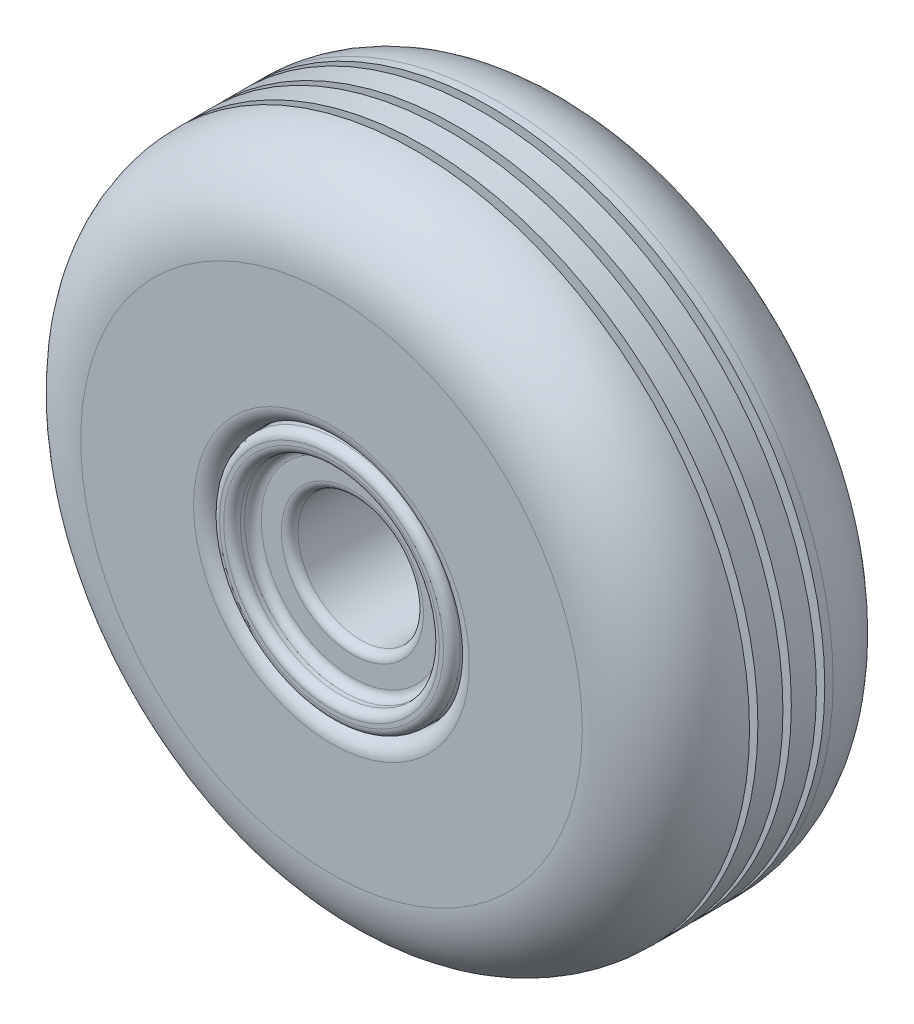
ISO-10303-21;
HEADER;
FILE_DESCRIPTION(('STEP AP214'),'2;1');
FILE_NAME('part.step','',(''),(''),'','','');
FILE_SCHEMA(('AUTOMOTIVE_DESIGN { 1 0 10303 214 1 1 1 1 }'));
ENDSEC;
DATA;
#1=APPLICATION_CONTEXT('core data for automotive mechanical design processes');
#2=APPLICATION_PROTOCOL_DEFINITION('international standard','automotive_design',2000,#1);
#3=PRODUCT_CONTEXT('',#1,'mechanical');
#4=PRODUCT('Part','Part','',(#3));
#5=PRODUCT_RELATED_PRODUCT_CATEGORY('part','',(#4));
#6=PRODUCT_DEFINITION_FORMATION('','',#4);
#7=PRODUCT_DEFINITION_CONTEXT('part definition',#1,'design');
#8=PRODUCT_DEFINITION('design','',#6,#7);
#9=PRODUCT_DEFINITION_SHAPE('','',#8);
#10=(LENGTH_UNIT() NAMED_UNIT(*) SI_UNIT(.MILLI.,.METRE.));
#11=(NAMED_UNIT(*) PLANE_ANGLE_UNIT() SI_UNIT($,.RADIAN.));
#12=(NAMED_UNIT(*) SI_UNIT($,.STERADIAN.) SOLID_ANGLE_UNIT());
#13=UNCERTAINTY_MEASURE_WITH_UNIT(LENGTH_MEASURE(1.E-05),#10,'distance_accuracy_value','');
#14=(GEOMETRIC_REPRESENTATION_CONTEXT(3) GLOBAL_UNCERTAINTY_ASSIGNED_CONTEXT((#13)) GLOBAL_UNIT_ASSIGNED_CONTEXT((#10,
#11,#12)) REPRESENTATION_CONTEXT('',''));
#15=CARTESIAN_POINT('',(0.,0.,0.));
#16=DIRECTION('',(0.,0.,1.));
#17=DIRECTION('',(1.,0.,0.));
#18=AXIS2_PLACEMENT_3D('',#15,#16,#17);
#19=CARTESIAN_POINT('',(0.,36.83,-38.1));
#20=DIRECTION('',(0.,0.,1.));
#21=DIRECTION('',(1.,0.,0.));
#22=AXIS2_PLACEMENT_3D('',#19,#20,#21);
#23=PLANE('',#22);
#24=CARTESIAN_POINT('',(0.,0.,-38.1));
#25=DIRECTION('',(0.,0.,1.));
#26=DIRECTION('',(1.,0.,0.));
#27=AXIS2_PLACEMENT_3D('',#24,#25,#26);
#28=CIRCLE('',#27,41.91);
#29=CARTESIAN_POINT('',(41.91,0.,-38.1));
#30=VERTEX_POINT('',#29);
#31=EDGE_CURVE('E61',#30,#30,#28,.T.);
#32=ORIENTED_EDGE('',*,*,#31,.T.);
#33=EDGE_LOOP('',(#32));
#34=FACE_BOUND('',#33,.T.);
#35=CARTESIAN_POINT('',(0.,0.,-38.1));
#36=DIRECTION('',(0.,0.,1.));
#37=DIRECTION('',(1.,0.,0.));
#38=AXIS2_PLACEMENT_3D('',#35,#36,#37);
#39=CIRCLE('',#38,76.1999999999998);
#40=CARTESIAN_POINT('',(76.1999999999998,0.,-38.1));
#41=VERTEX_POINT('',#40);
#42=EDGE_CURVE('E66',#41,#41,#39,.T.);
#43=ORIENTED_EDGE('',*,*,#42,.F.);
#44=EDGE_LOOP('',(#43));
#45=FACE_BOUND('',#44,.T.);
#46=ADVANCED_FACE('F46',(#34,#45),#23,.F.);
#47=CARTESIAN_POINT('',(0.,0.,-12.7));
#48=DIRECTION('',(0.,0.,1.));
#49=DIRECTION('',(1.,0.,0.));
#50=AXIS2_PLACEMENT_3D('',#47,#48,#49);
#51=TOROIDAL_SURFACE('',#50,76.2,25.4);
#52=CARTESIAN_POINT('',(0.,0.,-12.6999999999998));
#53=DIRECTION('',(0.,0.,1.));
#54=DIRECTION('',(1.,0.,0.));
#55=AXIS2_PLACEMENT_3D('',#52,#53,#54);
#56=CIRCLE('',#55,101.6);
#57=CARTESIAN_POINT('',(101.6,0.,-12.6999999999998));
#58=VERTEX_POINT('',#57);
#59=EDGE_CURVE('E69',#58,#58,#56,.T.);
#60=ORIENTED_EDGE('',*,*,#59,.F.);
#61=EDGE_LOOP('',(#60));
#62=FACE_BOUND('',#61,.T.);
#63=ORIENTED_EDGE('',*,*,#42,.T.);
#64=EDGE_LOOP('',(#63));
#65=FACE_BOUND('',#64,.T.);
#66=ADVANCED_FACE('F132',(#62,#65),#51,.T.);
#67=CARTESIAN_POINT('',(0.,0.,0.));
#68=DIRECTION('',(0.,0.,1.));
#69=DIRECTION('',(1.,0.,0.));
#70=AXIS2_PLACEMENT_3D('',#67,#68,#69);
#71=CYLINDRICAL_SURFACE('',#70,101.6);
#72=ORIENTED_EDGE('',*,*,#59,.T.);
#73=EDGE_LOOP('',(#72));
#74=FACE_BOUND('',#73,.T.);
#75=CARTESIAN_POINT('',(0.,0.,-10.16));
#76=DIRECTION('',(0.,0.,1.));
#77=DIRECTION('',(1.,0.,0.));
#78=AXIS2_PLACEMENT_3D('',#75,#76,#77);
#79=CIRCLE('',#78,101.6);
#80=CARTESIAN_POINT('',(101.6,0.,-10.16));
#81=VERTEX_POINT('',#80);
#82=EDGE_CURVE('E72',#81,#81,#79,.T.);
#83=ORIENTED_EDGE('',*,*,#82,.F.);
#84=EDGE_LOOP('',(#83));
#85=FACE_BOUND('',#84,.T.);
#86=ADVANCED_FACE('F138',(#74,#85),#71,.T.);
#87=CARTESIAN_POINT('',(0.,97.1840280376558,-10.16));
#88=DIRECTION('',(0.,0.,1.));
#89=DIRECTION('',(1.,0.,0.));
#90=AXIS2_PLACEMENT_3D('',#87,#88,#89);
#91=PLANE('',#90);
#92=ORIENTED_EDGE('',*,*,#82,.T.);
#93=EDGE_LOOP('',(#92));
#94=FACE_BOUND('',#93,.T.);
#95=CARTESIAN_POINT('',(0.,0.,-10.16));
#96=DIRECTION('',(0.,0.,1.));
#97=DIRECTION('',(1.,0.,0.));
#98=AXIS2_PLACEMENT_3D('',#95,#96,#97);
#99=CIRCLE('',#98,97.1840280376558);
#100=CARTESIAN_POINT('',(97.1840280376558,0.,-10.16));
#101=VERTEX_POINT('',#100);
#102=EDGE_CURVE('E75',#101,#101,#99,.T.);
#103=ORIENTED_EDGE('',*,*,#102,.F.);
#104=EDGE_LOOP('',(#103));
#105=FACE_BOUND('',#104,.T.);
#106=ADVANCED_FACE('F217',(#94,#105),#91,.T.);
#107=CARTESIAN_POINT('',(0.,0.,0.));
#108=DIRECTION('',(0.,0.,1.));
#109=DIRECTION('',(1.,0.,0.));
#110=AXIS2_PLACEMENT_3D('',#107,#108,#109);
#111=CYLINDRICAL_SURFACE('',#110,97.1840280376558);
#112=ORIENTED_EDGE('',*,*,#102,.T.);
#113=EDGE_LOOP('',(#112));
#114=FACE_BOUND('',#113,.T.);
#115=CARTESIAN_POINT('',(0.,0.,-7.62));
#116=DIRECTION('',(0.,0.,1.));
#117=DIRECTION('',(1.,0.,0.));
#118=AXIS2_PLACEMENT_3D('',#115,#116,#117);
#119=CIRCLE('',#118,97.1840280376558);
#120=CARTESIAN_POINT('',(97.1840280376558,0.,-7.62));
#121=VERTEX_POINT('',#120);
#122=EDGE_CURVE('E78',#121,#121,#119,.T.);
#123=ORIENTED_EDGE('',*,*,#122,.F.);
#124=EDGE_LOOP('',(#123));
#125=FACE_BOUND('',#124,.T.);
#126=ADVANCED_FACE('F222',(#114,#125),#111,.T.);
#127=CARTESIAN_POINT('',(0.,101.6,-7.62));
#128=DIRECTION('',(0.,0.,-1.));
#129=DIRECTION('',(-1.,0.,0.));
#130=AXIS2_PLACEMENT_3D('',#127,#128,#129);
#131=PLANE('',#130);
#132=ORIENTED_EDGE('',*,*,#122,.T.);
#133=EDGE_LOOP('',(#132));
#134=FACE_BOUND('',#133,.T.);
#135=CARTESIAN_POINT('',(0.,0.,-7.62));
#136=DIRECTION('',(0.,0.,1.));
#137=DIRECTION('',(1.,0.,0.));
#138=AXIS2_PLACEMENT_3D('',#135,#136,#137);
#139=CIRCLE('',#138,101.6);
#140=CARTESIAN_POINT('',(101.6,0.,-7.62));
#141=VERTEX_POINT('',#140);
#142=EDGE_CURVE('E81',#141,#141,#139,.T.);
#143=ORIENTED_EDGE('',*,*,#142,.F.);
#144=EDGE_LOOP('',(#143));
#145=FACE_BOUND('',#144,.T.);
#146=ADVANCED_FACE('F231',(#134,#145),#131,.T.);
#147=CARTESIAN_POINT('',(0.,0.,0.));
#148=DIRECTION('',(0.,0.,1.));
#149=DIRECTION('',(1.,0.,0.));
#150=AXIS2_PLACEMENT_3D('',#147,#148,#149);
#151=CYLINDRICAL_SURFACE('',#150,101.6);
#152=ORIENTED_EDGE('',*,*,#142,.T.);
#153=EDGE_LOOP('',(#152));
#154=FACE_BOUND('',#153,.T.);
#155=CARTESIAN_POINT('',(0.,0.,0.));
#156=DIRECTION('',(0.,0.,1.));
#157=DIRECTION('',(1.,0.,0.));
#158=AXIS2_PLACEMENT_3D('',#155,#156,#157);
#159=CIRCLE('',#158,101.6);
#160=CARTESIAN_POINT('',(101.6,0.,0.));
#161=VERTEX_POINT('',#160);
#162=EDGE_CURVE('E84',#161,#161,#159,.T.);
#163=ORIENTED_EDGE('',*,*,#162,.F.);
#164=EDGE_LOOP('',(#163));
#165=FACE_BOUND('',#164,.T.);
#166=ADVANCED_FACE('F207',(#154,#165),#151,.T.);
#167=CARTESIAN_POINT('',(0.,97.1840280376558,0.));
#168=DIRECTION('',(0.,0.,1.));
#169=DIRECTION('',(1.,0.,0.));
#170=AXIS2_PLACEMENT_3D('',#167,#168,#169);
#171=PLANE('',#170);
#172=ORIENTED_EDGE('',*,*,#162,.T.);
#173=EDGE_LOOP('',(#172));
#174=FACE_BOUND('',#173,.T.);
#175=CARTESIAN_POINT('',(0.,0.,0.));
#176=DIRECTION('',(0.,0.,1.));
#177=DIRECTION('',(1.,0.,0.));
#178=AXIS2_PLACEMENT_3D('',#175,#176,#177);
#179=CIRCLE('',#178,97.1840280376558);
#180=CARTESIAN_POINT('',(97.1840280376558,0.,0.));
#181=VERTEX_POINT('',#180);
#182=EDGE_CURVE('E87',#181,#181,#179,.T.);
#183=ORIENTED_EDGE('',*,*,#182,.F.);
#184=EDGE_LOOP('',(#183));
#185=FACE_BOUND('',#184,.T.);
#186=ADVANCED_FACE('F201',(#174,#185),#171,.T.);
#187=CARTESIAN_POINT('',(0.,0.,0.));
#188=DIRECTION('',(0.,0.,1.));
#189=DIRECTION('',(1.,0.,0.));
#190=AXIS2_PLACEMENT_3D('',#187,#188,#189);
#191=CYLINDRICAL_SURFACE('',#190,97.1840280376558);
#192=ORIENTED_EDGE('',*,*,#182,.T.);
#193=EDGE_LOOP('',(#192));
#194=FACE_BOUND('',#193,.T.);
#195=CARTESIAN_POINT('',(0.,0.,2.54));
#196=DIRECTION('',(0.,0.,1.));
#197=DIRECTION('',(1.,0.,0.));
#198=AXIS2_PLACEMENT_3D('',#195,#196,#197);
#199=CIRCLE('',#198,97.1840280376558);
#200=CARTESIAN_POINT('',(97.1840280376558,0.,2.54));
#201=VERTEX_POINT('',#200);
#202=EDGE_CURVE('E90',#201,#201,#199,.T.);
#203=ORIENTED_EDGE('',*,*,#202,.F.);
#204=EDGE_LOOP('',(#203));
#205=FACE_BOUND('',#204,.T.);
#206=ADVANCED_FACE('F206',(#194,#205),#191,.T.);
#207=CARTESIAN_POINT('',(0.,101.6,2.54));
#208=DIRECTION('',(0.,0.,-1.));
#209=DIRECTION('',(-1.,0.,0.));
#210=AXIS2_PLACEMENT_3D('',#207,#208,#209);
#211=PLANE('',#210);
#212=ORIENTED_EDGE('',*,*,#202,.T.);
#213=EDGE_LOOP('',(#212));
#214=FACE_BOUND('',#213,.T.);
#215=CARTESIAN_POINT('',(0.,0.,2.54));
#216=DIRECTION('',(0.,0.,1.));
#217=DIRECTION('',(1.,0.,0.));
#218=AXIS2_PLACEMENT_3D('',#215,#216,#217);
#219=CIRCLE('',#218,101.6);
#220=CARTESIAN_POINT('',(101.6,0.,2.54));
#221=VERTEX_POINT('',#220);
#222=EDGE_CURVE('E93',#221,#221,#219,.T.);
#223=ORIENTED_EDGE('',*,*,#222,.F.);
#224=EDGE_LOOP('',(#223));
#225=FACE_BOUND('',#224,.T.);
#226=ADVANCED_FACE('F255',(#214,#225),#211,.T.);
#227=CARTESIAN_POINT('',(0.,0.,0.));
#228=DIRECTION('',(0.,0.,1.));
#229=DIRECTION('',(1.,0.,0.));
#230=AXIS2_PLACEMENT_3D('',#227,#228,#229);
#231=CYLINDRICAL_SURFACE('',#230,101.6);
#232=ORIENTED_EDGE('',*,*,#222,.T.);
#233=EDGE_LOOP('',(#232));
#234=FACE_BOUND('',#233,.T.);
#235=CARTESIAN_POINT('',(0.,0.,10.1599999999998));
#236=DIRECTION('',(0.,0.,1.));
#237=DIRECTION('',(1.,0.,0.));
#238=AXIS2_PLACEMENT_3D('',#235,#236,#237);
#239=CIRCLE('',#238,101.6);
#240=CARTESIAN_POINT('',(101.6,0.,10.1599999999998));
#241=VERTEX_POINT('',#240);
#242=EDGE_CURVE('E96',#241,#241,#239,.T.);
#243=ORIENTED_EDGE('',*,*,#242,.F.);
#244=EDGE_LOOP('',(#243));
#245=FACE_BOUND('',#244,.T.);
#246=ADVANCED_FACE('F193',(#234,#245),#231,.T.);
#247=CARTESIAN_POINT('',(0.,97.1840280376558,10.1599999999998));
#248=DIRECTION('',(0.,0.,1.));
#249=DIRECTION('',(1.,0.,0.));
#250=AXIS2_PLACEMENT_3D('',#247,#248,#249);
#251=PLANE('',#250);
#252=ORIENTED_EDGE('',*,*,#242,.T.);
#253=EDGE_LOOP('',(#252));
#254=FACE_BOUND('',#253,.T.);
#255=CARTESIAN_POINT('',(0.,0.,10.1599999999998));
#256=DIRECTION('',(0.,0.,1.));
#257=DIRECTION('',(1.,0.,0.));
#258=AXIS2_PLACEMENT_3D('',#255,#256,#257);
#259=CIRCLE('',#258,97.1840280376558);
#260=CARTESIAN_POINT('',(97.1840280376558,0.,10.1599999999998));
#261=VERTEX_POINT('',#260);
#262=EDGE_CURVE('E99',#261,#261,#259,.T.);
#263=ORIENTED_EDGE('',*,*,#262,.F.);
#264=EDGE_LOOP('',(#263));
#265=FACE_BOUND('',#264,.T.);
#266=ADVANCED_FACE('F128',(#254,#265),#251,.T.);
#267=CARTESIAN_POINT('',(0.,0.,0.));
#268=DIRECTION('',(0.,0.,1.));
#269=DIRECTION('',(1.,0.,0.));
#270=AXIS2_PLACEMENT_3D('',#267,#268,#269);
#271=CYLINDRICAL_SURFACE('',#270,97.1840280376558);
#272=ORIENTED_EDGE('',*,*,#262,.T.);
#273=EDGE_LOOP('',(#272));
#274=FACE_BOUND('',#273,.T.);
#275=CARTESIAN_POINT('',(0.,0.,12.6999999999998));
#276=DIRECTION('',(0.,0.,1.));
#277=DIRECTION('',(1.,0.,0.));
#278=AXIS2_PLACEMENT_3D('',#275,#276,#277);
#279=CIRCLE('',#278,97.1840280376558);
#280=CARTESIAN_POINT('',(97.1840280376558,0.,12.6999999999998));
#281=VERTEX_POINT('',#280);
#282=EDGE_CURVE('E102',#281,#281,#279,.T.);
#283=ORIENTED_EDGE('',*,*,#282,.F.);
#284=EDGE_LOOP('',(#283));
#285=FACE_BOUND('',#284,.T.);
#286=ADVANCED_FACE('F122',(#274,#285),#271,.T.);
#287=CARTESIAN_POINT('',(0.,101.6,12.6999999999998));
#288=DIRECTION('',(0.,0.,-1.));
#289=DIRECTION('',(-1.,0.,0.));
#290=AXIS2_PLACEMENT_3D('',#287,#288,#289);
#291=PLANE('',#290);
#292=ORIENTED_EDGE('',*,*,#282,.T.);
#293=EDGE_LOOP('',(#292));
#294=FACE_BOUND('',#293,.T.);
#295=CARTESIAN_POINT('',(0.,0.,12.6999999999998));
#296=DIRECTION('',(0.,0.,1.));
#297=DIRECTION('',(1.,0.,0.));
#298=AXIS2_PLACEMENT_3D('',#295,#296,#297);
#299=CIRCLE('',#298,101.6);
#300=CARTESIAN_POINT('',(101.6,0.,12.6999999999998));
#301=VERTEX_POINT('',#300);
#302=EDGE_CURVE('E105',#301,#301,#299,.T.);
#303=ORIENTED_EDGE('',*,*,#302,.F.);
#304=EDGE_LOOP('',(#303));
#305=FACE_BOUND('',#304,.T.);
#306=ADVANCED_FACE('F117',(#294,#305),#291,.T.);
#307=CARTESIAN_POINT('',(0.,0.,12.7));
#308=DIRECTION('',(0.,0.,1.));
#309=DIRECTION('',(1.,0.,0.));
#310=AXIS2_PLACEMENT_3D('',#307,#308,#309);
#311=TOROIDAL_SURFACE('',#310,76.2,25.4);
#312=CARTESIAN_POINT('',(0.,0.,38.1));
#313=DIRECTION('',(0.,0.,1.));
#314=DIRECTION('',(1.,0.,0.));
#315=AXIS2_PLACEMENT_3D('',#312,#313,#314);
#316=CIRCLE('',#315,76.1999999999998);
#317=CARTESIAN_POINT('',(76.1999999999998,0.,38.1));
#318=VERTEX_POINT('',#317);
#319=EDGE_CURVE('E108',#318,#318,#316,.T.);
#320=ORIENTED_EDGE('',*,*,#319,.F.);
#321=EDGE_LOOP('',(#320));
#322=FACE_BOUND('',#321,.T.);
#323=ORIENTED_EDGE('',*,*,#302,.T.);
#324=EDGE_LOOP('',(#323));
#325=FACE_BOUND('',#324,.T.);
#326=ADVANCED_FACE('F114',(#322,#325),#311,.T.);
#327=CARTESIAN_POINT('',(0.,76.1999999999998,38.1));
#328=DIRECTION('',(0.,0.,-1.));
#329=DIRECTION('',(-1.,0.,0.));
#330=AXIS2_PLACEMENT_3D('',#327,#328,#329);
#331=PLANE('',#330);
#332=CARTESIAN_POINT('',(0.,0.,38.1));
#333=DIRECTION('',(0.,0.,-1.));
#334=DIRECTION('',(-1.,0.,0.));
#335=AXIS2_PLACEMENT_3D('',#332,#333,#334);
#336=CIRCLE('',#335,41.91);
#337=CARTESIAN_POINT('',(-41.91,0.,38.1));
#338=VERTEX_POINT('',#337);
#339=EDGE_CURVE('E11',#338,#338,#336,.T.);
#340=ORIENTED_EDGE('',*,*,#339,.T.);
#341=EDGE_LOOP('',(#340));
#342=FACE_BOUND('',#341,.T.);
#343=ORIENTED_EDGE('',*,*,#319,.T.);
#344=EDGE_LOOP('',(#343));
#345=FACE_BOUND('',#344,.T.);
#346=ADVANCED_FACE('F112',(#342,#345),#331,.F.);
#347=CARTESIAN_POINT('',(0.,0.,0.));
#348=DIRECTION('',(0.,0.,1.));
#349=DIRECTION('',(1.,0.,0.));
#350=AXIS2_PLACEMENT_3D('',#347,#348,#349);
#351=CYLINDRICAL_SURFACE('',#350,36.83);
#352=CARTESIAN_POINT('',(0.,0.,-33.02));
#353=DIRECTION('',(0.,0.,1.));
#354=DIRECTION('',(1.,0.,0.));
#355=AXIS2_PLACEMENT_3D('',#352,#353,#354);
#356=CIRCLE('',#355,36.83);
#357=CARTESIAN_POINT('',(36.83,0.,-33.02));
#358=VERTEX_POINT('',#357);
#359=EDGE_CURVE('E53',#358,#358,#356,.F.);
#360=ORIENTED_EDGE('',*,*,#359,.T.);
#361=EDGE_LOOP('',(#360));
#362=FACE_BOUND('',#361,.T.);
#363=CARTESIAN_POINT('',(0.,0.,33.02));
#364=DIRECTION('',(0.,0.,-1.));
#365=DIRECTION('',(-1.,0.,0.));
#366=AXIS2_PLACEMENT_3D('',#363,#364,#365);
#367=CIRCLE('',#366,36.83);
#368=CARTESIAN_POINT('',(-36.83,0.,33.02));
#369=VERTEX_POINT('',#368);
#370=EDGE_CURVE('E57',#369,#369,#367,.F.);
#371=ORIENTED_EDGE('',*,*,#370,.T.);
#372=EDGE_LOOP('',(#371));
#373=FACE_BOUND('',#372,.T.);
#374=ADVANCED_FACE('F145',(#362,#373),#351,.F.);
#375=CARTESIAN_POINT('',(0.,0.,-33.02));
#376=DIRECTION('',(0.,0.,1.));
#377=DIRECTION('',(1.,0.,0.));
#378=AXIS2_PLACEMENT_3D('',#375,#376,#377);
#379=TOROIDAL_SURFACE('',#378,41.91,5.08);
#380=ORIENTED_EDGE('',*,*,#359,.F.);
#381=EDGE_LOOP('',(#380));
#382=FACE_BOUND('',#381,.T.);
#383=ORIENTED_EDGE('',*,*,#31,.F.);
#384=EDGE_LOOP('',(#383));
#385=FACE_BOUND('',#384,.T.);
#386=ADVANCED_FACE('F143',(#382,#385),#379,.T.);
#387=CARTESIAN_POINT('',(0.,0.,33.02));
#388=DIRECTION('',(0.,0.,-1.));
#389=DIRECTION('',(-1.,0.,0.));
#390=AXIS2_PLACEMENT_3D('',#387,#388,#389);
#391=TOROIDAL_SURFACE('',#390,41.91,5.08);
#392=ORIENTED_EDGE('',*,*,#339,.F.);
#393=EDGE_LOOP('',(#392));
#394=FACE_BOUND('',#393,.T.);
#395=ORIENTED_EDGE('',*,*,#370,.F.);
#396=EDGE_LOOP('',(#395));
#397=FACE_BOUND('',#396,.T.);
#398=ADVANCED_FACE('F48',(#394,#397),#391,.T.);
#399=CLOSED_SHELL('',(#46,#66,#86,#106,#126,#146,#166,#186,#206,#226,#246,#266,#286,#306,#326,
#346,#374,#386,#398));
#400=MANIFOLD_SOLID_BREP('B2',#399);
#401=CARTESIAN_POINT('',(0.,0.,-31.75));
#402=DIRECTION('',(0.,0.,1.));
#403=DIRECTION('',(1.,0.,0.));
#404=AXIS2_PLACEMENT_3D('',#401,#402,#403);
#405=PLANE('',#404);
#406=CARTESIAN_POINT('',(0.,0.,-31.75));
#407=DIRECTION('',(0.,0.,1.));
#408=DIRECTION('',(1.,0.,0.));
#409=AXIS2_PLACEMENT_3D('',#406,#407,#408);
#410=CIRCLE('',#409,27.686);
#411=CARTESIAN_POINT('',(27.686,0.,-31.75));
#412=VERTEX_POINT('',#411);
#413=EDGE_CURVE('E379',#412,#412,#410,.F.);
#414=ORIENTED_EDGE('',*,*,#413,.T.);
#415=EDGE_LOOP('',(#414));
#416=FACE_BOUND('',#415,.T.);
#417=CARTESIAN_POINT('',(0.,0.,-31.75));
#418=DIRECTION('',(0.,0.,1.));
#419=DIRECTION('',(1.,0.,0.));
#420=AXIS2_PLACEMENT_3D('',#417,#418,#419);
#421=CIRCLE('',#420,21.59);
#422=CARTESIAN_POINT('',(21.59,0.,-31.75));
#423=VERTEX_POINT('',#422);
#424=EDGE_CURVE('E383',#423,#423,#421,.T.);
#425=ORIENTED_EDGE('',*,*,#424,.T.);
#426=EDGE_LOOP('',(#425));
#427=FACE_BOUND('',#426,.T.);
#428=ADVANCED_FACE('F368',(#416,#427),#405,.F.);
#429=CARTESIAN_POINT('',(0.,0.,31.75));
#430=DIRECTION('',(0.,0.,1.));
#431=DIRECTION('',(1.,0.,0.));
#432=AXIS2_PLACEMENT_3D('',#429,#430,#431);
#433=CYLINDRICAL_SURFACE('',#432,30.226);
#434=CARTESIAN_POINT('',(0.,0.,-34.29));
#435=DIRECTION('',(0.,0.,1.));
#436=DIRECTION('',(1.,0.,0.));
#437=AXIS2_PLACEMENT_3D('',#434,#435,#436);
#438=CIRCLE('',#437,30.226);
#439=CARTESIAN_POINT('',(30.226,0.,-34.29));
#440=VERTEX_POINT('',#439);
#441=EDGE_CURVE('E388',#440,#440,#438,.T.);
#442=ORIENTED_EDGE('',*,*,#441,.T.);
#443=EDGE_LOOP('',(#442));
#444=FACE_BOUND('',#443,.T.);
#445=CARTESIAN_POINT('',(0.,0.,-35.56));
#446=DIRECTION('',(0.,0.,1.));
#447=DIRECTION('',(1.,0.,0.));
#448=AXIS2_PLACEMENT_3D('',#445,#446,#447);
#449=CIRCLE('',#448,30.226);
#450=CARTESIAN_POINT('',(30.226,0.,-35.56));
#451=VERTEX_POINT('',#450);
#452=EDGE_CURVE('E391',#451,#451,#449,.F.);
#453=ORIENTED_EDGE('',*,*,#452,.T.);
#454=EDGE_LOOP('',(#453));
#455=FACE_BOUND('',#454,.T.);
#456=ADVANCED_FACE('F445',(#444,#455),#433,.F.);
#457=CARTESIAN_POINT('',(0.,30.226,-38.1));
#458=DIRECTION('',(0.,0.,1.));
#459=DIRECTION('',(1.,0.,0.));
#460=AXIS2_PLACEMENT_3D('',#457,#458,#459);
#461=PLANE('',#460);
#462=CARTESIAN_POINT('',(0.,0.,-38.1));
#463=DIRECTION('',(0.,0.,1.));
#464=DIRECTION('',(1.,0.,0.));
#465=AXIS2_PLACEMENT_3D('',#462,#463,#464);
#466=CIRCLE('',#465,34.036);
#467=CARTESIAN_POINT('',(34.036,0.,-38.1));
#468=VERTEX_POINT('',#467);
#469=EDGE_CURVE('E45',#468,#468,#466,.F.);
#470=ORIENTED_EDGE('',*,*,#469,.T.);
#471=EDGE_LOOP('',(#470));
#472=FACE_BOUND('',#471,.T.);
#473=CARTESIAN_POINT('',(0.,0.,-38.1));
#474=DIRECTION('',(0.,0.,1.));
#475=DIRECTION('',(1.,0.,0.));
#476=AXIS2_PLACEMENT_3D('',#473,#474,#475);
#477=CIRCLE('',#476,32.766);
#478=CARTESIAN_POINT('',(32.766,0.,-38.1));
#479=VERTEX_POINT('',#478);
#480=EDGE_CURVE('E375',#479,#479,#477,.T.);
#481=ORIENTED_EDGE('',*,*,#480,.T.);
#482=EDGE_LOOP('',(#481));
#483=FACE_BOUND('',#482,.T.);
#484=ADVANCED_FACE('F451',(#472,#483),#461,.F.);
#485=CARTESIAN_POINT('',(0.,0.,31.75));
#486=DIRECTION('',(0.,0.,1.));
#487=DIRECTION('',(1.,0.,0.));
#488=AXIS2_PLACEMENT_3D('',#485,#486,#487);
#489=CYLINDRICAL_SURFACE('',#488,36.576);
#490=CARTESIAN_POINT('',(0.,0.,35.56));
#491=DIRECTION('',(0.,0.,1.));
#492=DIRECTION('',(1.,0.,0.));
#493=AXIS2_PLACEMENT_3D('',#490,#491,#492);
#494=CIRCLE('',#493,36.576);
#495=CARTESIAN_POINT('',(36.576,0.,35.56));
#496=VERTEX_POINT('',#495);
#497=EDGE_CURVE('E394',#496,#496,#494,.F.);
#498=ORIENTED_EDGE('',*,*,#497,.T.);
#499=EDGE_LOOP('',(#498));
#500=FACE_BOUND('',#499,.T.);
#501=CARTESIAN_POINT('',(0.,0.,-35.56));
#502=DIRECTION('',(0.,0.,1.));
#503=DIRECTION('',(1.,0.,0.));
#504=AXIS2_PLACEMENT_3D('',#501,#502,#503);
#505=CIRCLE('',#504,36.576);
#506=CARTESIAN_POINT('',(36.576,0.,-35.56));
#507=VERTEX_POINT('',#506);
#508=EDGE_CURVE('E397',#507,#507,#505,.T.);
#509=ORIENTED_EDGE('',*,*,#508,.T.);
#510=EDGE_LOOP('',(#509));
#511=FACE_BOUND('',#510,.T.);
#512=ADVANCED_FACE('F458',(#500,#511),#489,.T.);
#513=CARTESIAN_POINT('',(0.,30.226,38.1));
#514=DIRECTION('',(0.,0.,1.));
#515=DIRECTION('',(1.,0.,0.));
#516=AXIS2_PLACEMENT_3D('',#513,#514,#515);
#517=PLANE('',#516);
#518=CARTESIAN_POINT('',(0.,0.,38.1));
#519=DIRECTION('',(0.,0.,1.));
#520=DIRECTION('',(1.,0.,0.));
#521=AXIS2_PLACEMENT_3D('',#518,#519,#520);
#522=CIRCLE('',#521,32.766);
#523=CARTESIAN_POINT('',(32.766,0.,38.1));
#524=VERTEX_POINT('',#523);
#525=EDGE_CURVE('E400',#524,#524,#522,.F.);
#526=ORIENTED_EDGE('',*,*,#525,.T.);
#527=EDGE_LOOP('',(#526));
#528=FACE_BOUND('',#527,.T.);
#529=CARTESIAN_POINT('',(0.,0.,38.1));
#530=DIRECTION('',(0.,0.,1.));
#531=DIRECTION('',(1.,0.,0.));
#532=AXIS2_PLACEMENT_3D('',#529,#530,#531);
#533=CIRCLE('',#532,34.036);
#534=CARTESIAN_POINT('',(34.036,0.,38.1));
#535=VERTEX_POINT('',#534);
#536=EDGE_CURVE('E403',#535,#535,#533,.T.);
#537=ORIENTED_EDGE('',*,*,#536,.T.);
#538=EDGE_LOOP('',(#537));
#539=FACE_BOUND('',#538,.T.);
#540=ADVANCED_FACE('F461',(#528,#539),#517,.T.);
#541=CARTESIAN_POINT('',(0.,0.,31.75));
#542=DIRECTION('',(0.,0.,1.));
#543=DIRECTION('',(1.,0.,0.));
#544=AXIS2_PLACEMENT_3D('',#541,#542,#543);
#545=CYLINDRICAL_SURFACE('',#544,30.226);
#546=CARTESIAN_POINT('',(0.,0.,34.29));
#547=DIRECTION('',(0.,0.,-1.));
#548=DIRECTION('',(-1.,0.,0.));
#549=AXIS2_PLACEMENT_3D('',#546,#547,#548);
#550=CIRCLE('',#549,30.226);
#551=CARTESIAN_POINT('',(-30.226,0.,34.29));
#552=VERTEX_POINT('',#551);
#553=EDGE_CURVE('E406',#552,#552,#550,.T.);
#554=ORIENTED_EDGE('',*,*,#553,.T.);
#555=EDGE_LOOP('',(#554));
#556=FACE_BOUND('',#555,.T.);
#557=CARTESIAN_POINT('',(0.,0.,35.56));
#558=DIRECTION('',(0.,0.,1.));
#559=DIRECTION('',(1.,0.,0.));
#560=AXIS2_PLACEMENT_3D('',#557,#558,#559);
#561=CIRCLE('',#560,30.226);
#562=CARTESIAN_POINT('',(30.226,0.,35.56));
#563=VERTEX_POINT('',#562);
#564=EDGE_CURVE('E409',#563,#563,#561,.T.);
#565=ORIENTED_EDGE('',*,*,#564,.T.);
#566=EDGE_LOOP('',(#565));
#567=FACE_BOUND('',#566,.T.);
#568=ADVANCED_FACE('F465',(#556,#567),#545,.F.);
#569=CARTESIAN_POINT('',(0.,30.226,31.75));
#570=DIRECTION('',(0.,0.,-1.));
#571=DIRECTION('',(-1.,0.,0.));
#572=AXIS2_PLACEMENT_3D('',#569,#570,#571);
#573=PLANE('',#572);
#574=CARTESIAN_POINT('',(0.,0.,31.75));
#575=DIRECTION('',(0.,0.,-1.));
#576=DIRECTION('',(-1.,0.,0.));
#577=AXIS2_PLACEMENT_3D('',#574,#575,#576);
#578=CIRCLE('',#577,21.59);
#579=CARTESIAN_POINT('',(-21.59,0.,31.75));
#580=VERTEX_POINT('',#579);
#581=EDGE_CURVE('E418',#580,#580,#578,.T.);
#582=ORIENTED_EDGE('',*,*,#581,.T.);
#583=EDGE_LOOP('',(#582));
#584=FACE_BOUND('',#583,.T.);
#585=CARTESIAN_POINT('',(0.,0.,31.75));
#586=DIRECTION('',(0.,0.,-1.));
#587=DIRECTION('',(-1.,0.,0.));
#588=AXIS2_PLACEMENT_3D('',#585,#586,#587);
#589=CIRCLE('',#588,27.686);
#590=CARTESIAN_POINT('',(-27.686,0.,31.75));
#591=VERTEX_POINT('',#590);
#592=EDGE_CURVE('E421',#591,#591,#589,.F.);
#593=ORIENTED_EDGE('',*,*,#592,.T.);
#594=EDGE_LOOP('',(#593));
#595=FACE_BOUND('',#594,.T.);
#596=ADVANCED_FACE('F425',(#584,#595),#573,.F.);
#597=CARTESIAN_POINT('',(0.,0.,38.101));
#598=DIRECTION('',(0.,0.,-1.));
#599=DIRECTION('',(-1.,0.,0.));
#600=AXIS2_PLACEMENT_3D('',#597,#598,#599);
#601=CYLINDRICAL_SURFACE('',#600,19.05);
#602=CARTESIAN_POINT('',(0.,0.,29.21));
#603=DIRECTION('',(0.,0.,-1.));
#604=DIRECTION('',(-1.,0.,0.));
#605=AXIS2_PLACEMENT_3D('',#602,#603,#604);
#606=CIRCLE('',#605,19.05);
#607=CARTESIAN_POINT('',(-19.05,0.,29.21));
#608=VERTEX_POINT('',#607);
#609=EDGE_CURVE('E412',#608,#608,#606,.F.);
#610=ORIENTED_EDGE('',*,*,#609,.T.);
#611=EDGE_LOOP('',(#610));
#612=FACE_BOUND('',#611,.T.);
#613=CARTESIAN_POINT('',(0.,0.,-29.21));
#614=DIRECTION('',(0.,0.,1.));
#615=DIRECTION('',(1.,0.,0.));
#616=AXIS2_PLACEMENT_3D('',#613,#614,#615);
#617=CIRCLE('',#616,19.05);
#618=CARTESIAN_POINT('',(19.05,0.,-29.21));
#619=VERTEX_POINT('',#618);
#620=EDGE_CURVE('E415',#619,#619,#617,.F.);
#621=ORIENTED_EDGE('',*,*,#620,.T.);
#622=EDGE_LOOP('',(#621));
#623=FACE_BOUND('',#622,.T.);
#624=ADVANCED_FACE('F440',(#612,#623),#601,.F.);
#625=CARTESIAN_POINT('',(0.,0.,29.21));
#626=DIRECTION('',(0.,0.,-1.));
#627=DIRECTION('',(-1.,0.,0.));
#628=AXIS2_PLACEMENT_3D('',#625,#626,#627);
#629=TOROIDAL_SURFACE('',#628,21.59,2.54);
#630=ORIENTED_EDGE('',*,*,#609,.F.);
#631=EDGE_LOOP('',(#630));
#632=FACE_BOUND('',#631,.T.);
#633=ORIENTED_EDGE('',*,*,#581,.F.);
#634=EDGE_LOOP('',(#633));
#635=FACE_BOUND('',#634,.T.);
#636=ADVANCED_FACE('F430',(#632,#635),#629,.T.);
#637=CARTESIAN_POINT('',(0.,0.,34.29));
#638=DIRECTION('',(0.,0.,-1.));
#639=DIRECTION('',(-1.,0.,0.));
#640=AXIS2_PLACEMENT_3D('',#637,#638,#639);
#641=TOROIDAL_SURFACE('',#640,27.686,2.54);
#642=ORIENTED_EDGE('',*,*,#553,.F.);
#643=EDGE_LOOP('',(#642));
#644=FACE_BOUND('',#643,.T.);
#645=ORIENTED_EDGE('',*,*,#592,.F.);
#646=EDGE_LOOP('',(#645));
#647=FACE_BOUND('',#646,.T.);
#648=ADVANCED_FACE('F427',(#644,#647),#641,.F.);
#649=CARTESIAN_POINT('',(0.,0.,35.56));
#650=DIRECTION('',(0.,0.,1.));
#651=DIRECTION('',(1.,0.,0.));
#652=AXIS2_PLACEMENT_3D('',#649,#650,#651);
#653=TOROIDAL_SURFACE('',#652,32.766,2.54);
#654=ORIENTED_EDGE('',*,*,#525,.F.);
#655=EDGE_LOOP('',(#654));
#656=FACE_BOUND('',#655,.T.);
#657=ORIENTED_EDGE('',*,*,#564,.F.);
#658=EDGE_LOOP('',(#657));
#659=FACE_BOUND('',#658,.T.);
#660=ADVANCED_FACE('F429',(#656,#659),#653,.T.);
#661=CARTESIAN_POINT('',(0.,0.,35.56));
#662=DIRECTION('',(0.,0.,1.));
#663=DIRECTION('',(1.,0.,0.));
#664=AXIS2_PLACEMENT_3D('',#661,#662,#663);
#665=TOROIDAL_SURFACE('',#664,34.036,2.54);
#666=ORIENTED_EDGE('',*,*,#497,.F.);
#667=EDGE_LOOP('',(#666));
#668=FACE_BOUND('',#667,.T.);
#669=ORIENTED_EDGE('',*,*,#536,.F.);
#670=EDGE_LOOP('',(#669));
#671=FACE_BOUND('',#670,.T.);
#672=ADVANCED_FACE('F437',(#668,#671),#665,.T.);
#673=CARTESIAN_POINT('',(0.,0.,-34.29));
#674=DIRECTION('',(0.,0.,1.));
#675=DIRECTION('',(1.,0.,0.));
#676=AXIS2_PLACEMENT_3D('',#673,#674,#675);
#677=TOROIDAL_SURFACE('',#676,27.686,2.54);
#678=ORIENTED_EDGE('',*,*,#413,.F.);
#679=EDGE_LOOP('',(#678));
#680=FACE_BOUND('',#679,.T.);
#681=ORIENTED_EDGE('',*,*,#441,.F.);
#682=EDGE_LOOP('',(#681));
#683=FACE_BOUND('',#682,.T.);
#684=ADVANCED_FACE('F484',(#680,#683),#677,.F.);
#685=CARTESIAN_POINT('',(0.,0.,-29.21));
#686=DIRECTION('',(0.,0.,1.));
#687=DIRECTION('',(1.,0.,0.));
#688=AXIS2_PLACEMENT_3D('',#685,#686,#687);
#689=TOROIDAL_SURFACE('',#688,21.59,2.54);
#690=ORIENTED_EDGE('',*,*,#424,.F.);
#691=EDGE_LOOP('',(#690));
#692=FACE_BOUND('',#691,.T.);
#693=ORIENTED_EDGE('',*,*,#620,.F.);
#694=EDGE_LOOP('',(#693));
#695=FACE_BOUND('',#694,.T.);
#696=ADVANCED_FACE('F481',(#692,#695),#689,.T.);
#697=CARTESIAN_POINT('',(0.,0.,-35.56));
#698=DIRECTION('',(0.,0.,1.));
#699=DIRECTION('',(1.,0.,0.));
#700=AXIS2_PLACEMENT_3D('',#697,#698,#699);
#701=TOROIDAL_SURFACE('',#700,34.036,2.54);
#702=ORIENTED_EDGE('',*,*,#469,.F.);
#703=EDGE_LOOP('',(#702));
#704=FACE_BOUND('',#703,.T.);
#705=ORIENTED_EDGE('',*,*,#508,.F.);
#706=EDGE_LOOP('',(#705));
#707=FACE_BOUND('',#706,.T.);
#708=ADVANCED_FACE('F483',(#704,#707),#701,.T.);
#709=CARTESIAN_POINT('',(0.,0.,-35.56));
#710=DIRECTION('',(0.,0.,1.));
#711=DIRECTION('',(1.,0.,0.));
#712=AXIS2_PLACEMENT_3D('',#709,#710,#711);
#713=TOROIDAL_SURFACE('',#712,32.766,2.54);
#714=ORIENTED_EDGE('',*,*,#452,.F.);
#715=EDGE_LOOP('',(#714));
#716=FACE_BOUND('',#715,.T.);
#717=ORIENTED_EDGE('',*,*,#480,.F.);
#718=EDGE_LOOP('',(#717));
#719=FACE_BOUND('',#718,.T.);
#720=ADVANCED_FACE('F370',(#716,#719),#713,.T.);
#721=CLOSED_SHELL('',(#428,#456,#484,#512,#540,#568,#596,#624,#636,#648,#660,#672,#684,#696,
#708,#720));
#722=MANIFOLD_SOLID_BREP('B6',#721);
#723=ADVANCED_BREP_SHAPE_REPRESENTATION('',(#18,#400,#722),#14);
#724=SHAPE_DEFINITION_REPRESENTATION(#9,#723);
ENDSEC;
END-ISO-10303-21;
